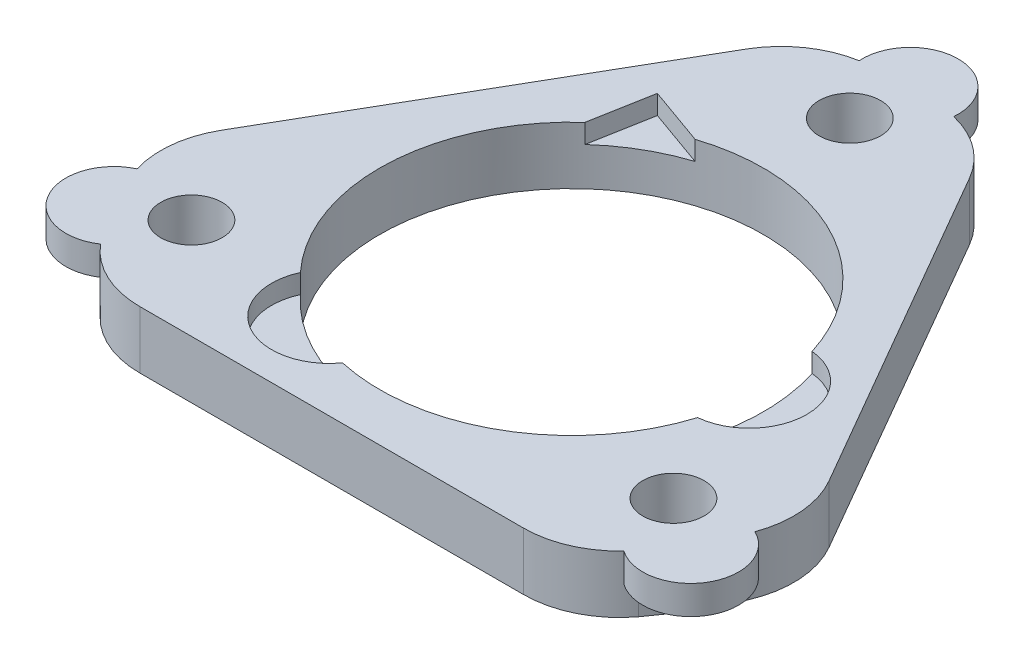
ISO-10303-21;
HEADER;
FILE_DESCRIPTION(('STEP AP214'),'2;1');
FILE_NAME('part.step','',(''),(''),'','','');
FILE_SCHEMA(('AUTOMOTIVE_DESIGN { 1 0 10303 214 1 1 1 1 }'));
ENDSEC;
DATA;
#1=APPLICATION_CONTEXT('core data for automotive mechanical design processes');
#2=APPLICATION_PROTOCOL_DEFINITION('international standard','automotive_design',2000,#1);
#3=PRODUCT_CONTEXT('',#1,'mechanical');
#4=PRODUCT('Part','Part','',(#3));
#5=PRODUCT_RELATED_PRODUCT_CATEGORY('part','',(#4));
#6=PRODUCT_DEFINITION_FORMATION('','',#4);
#7=PRODUCT_DEFINITION_CONTEXT('part definition',#1,'design');
#8=PRODUCT_DEFINITION('design','',#6,#7);
#9=PRODUCT_DEFINITION_SHAPE('','',#8);
#10=(LENGTH_UNIT() NAMED_UNIT(*) SI_UNIT(.MILLI.,.METRE.));
#11=(NAMED_UNIT(*) PLANE_ANGLE_UNIT() SI_UNIT($,.RADIAN.));
#12=(NAMED_UNIT(*) SI_UNIT($,.STERADIAN.) SOLID_ANGLE_UNIT());
#13=UNCERTAINTY_MEASURE_WITH_UNIT(LENGTH_MEASURE(1.E-05),#10,'distance_accuracy_value','');
#14=(GEOMETRIC_REPRESENTATION_CONTEXT(3) GLOBAL_UNCERTAINTY_ASSIGNED_CONTEXT((#13)) GLOBAL_UNIT_ASSIGNED_CONTEXT((#10,
#11,#12)) REPRESENTATION_CONTEXT('',''));
#15=CARTESIAN_POINT('',(0.,0.,0.));
#16=DIRECTION('',(0.,0.,1.));
#17=DIRECTION('',(1.,0.,0.));
#18=AXIS2_PLACEMENT_3D('',#15,#16,#17);
#19=CARTESIAN_POINT('',(0.,6.,0.));
#20=DIRECTION('',(0.,1.,0.));
#21=DIRECTION('',(0.,0.,1.));
#22=AXIS2_PLACEMENT_3D('',#19,#20,#21);
#23=PLANE('',#22);
#24=CARTESIAN_POINT('',(-25.1147367097487,6.,14.5));
#25=DIRECTION('',(0.,1.,0.));
#26=DIRECTION('',(0.,0.,1.));
#27=AXIS2_PLACEMENT_3D('',#24,#25,#26);
#28=CIRCLE('',#27,3.2);
#29=CARTESIAN_POINT('',(-25.1147367097487,6.,17.7));
#30=VERTEX_POINT('',#29);
#31=EDGE_CURVE('E247',#30,#30,#28,.T.);
#32=ORIENTED_EDGE('',*,*,#31,.F.);
#33=EDGE_LOOP('',(#32));
#34=FACE_BOUND('',#33,.T.);
#35=CARTESIAN_POINT('',(25.1147367097487,6.,14.5));
#36=DIRECTION('',(0.,1.,0.));
#37=DIRECTION('',(0.,0.,1.));
#38=AXIS2_PLACEMENT_3D('',#35,#36,#37);
#39=CIRCLE('',#38,3.2);
#40=CARTESIAN_POINT('',(25.1147367097487,6.,17.7));
#41=VERTEX_POINT('',#40);
#42=EDGE_CURVE('E484',#41,#41,#39,.T.);
#43=ORIENTED_EDGE('',*,*,#42,.F.);
#44=EDGE_LOOP('',(#43));
#45=FACE_BOUND('',#44,.T.);
#46=CARTESIAN_POINT('',(0.,6.,-29.));
#47=DIRECTION('',(0.,1.,0.));
#48=DIRECTION('',(0.,0.,1.));
#49=AXIS2_PLACEMENT_3D('',#46,#47,#48);
#50=CIRCLE('',#49,3.2);
#51=CARTESIAN_POINT('',(0.,6.,-25.8));
#52=VERTEX_POINT('',#51);
#53=EDGE_CURVE('E487',#52,#52,#50,.T.);
#54=ORIENTED_EDGE('',*,*,#53,.F.);
#55=EDGE_LOOP('',(#54));
#56=FACE_BOUND('',#55,.T.);
#57=CARTESIAN_POINT('',(-9.23755118839425,6.,16.0286508490826));
#58=DIRECTION('',(0.,1.,0.));
#59=DIRECTION('',(0.,0.,1.));
#60=AXIS2_PLACEMENT_3D('',#57,#58,#59);
#61=CIRCLE('',#60,6.);
#62=CARTESIAN_POINT('',(-14.7045464027304,6.,13.556412323692));
#63=VERTEX_POINT('',#62);
#64=CARTESIAN_POINT('',(-4.3576026894637,6.,19.519510721347));
#65=VERTEX_POINT('',#64);
#66=EDGE_CURVE('E205',#63,#65,#61,.T.);
#67=ORIENTED_EDGE('',*,*,#66,.F.);
#68=CARTESIAN_POINT('',(0.,6.,0.));
#69=DIRECTION('',(0.,1.,0.));
#70=DIRECTION('',(0.,0.,1.));
#71=AXIS2_PLACEMENT_3D('',#68,#69,#70);
#72=CIRCLE('',#71,20.);
#73=CARTESIAN_POINT('',(-13.425383069926,6.,-14.8242736559247));
#74=VERTEX_POINT('',#73);
#75=EDGE_CURVE('E218',#74,#63,#72,.T.);
#76=ORIENTED_EDGE('',*,*,#75,.F.);
#77=DIRECTION('',(-0.178618155289891,0.,0.983918469488624));
#78=VECTOR('',#77,1.);
#79=CARTESIAN_POINT('',(-15.6023560487492,6.,-2.83241360135468));
#80=LINE('',#79,#78);
#81=CARTESIAN_POINT('',(-12.2664788714975,6.,-21.2080997756778));
#82=VERTEX_POINT('',#81);
#83=EDGE_CURVE('E238',#82,#74,#80,.T.);
#84=ORIENTED_EDGE('',*,*,#83,.F.);
#85=DIRECTION('',(0.941930338748527,0.,0.335808333644484));
#86=VECTOR('',#85,1.);
#87=CARTESIAN_POINT('',(5.32503591317024,6.,-14.9365348593483));
#88=LINE('',#87,#86);
#89=CARTESIAN_POINT('',(-6.15507870374182,6.,-19.029319644978));
#90=VERTEX_POINT('',#89);
#91=EDGE_CURVE('E244',#82,#90,#88,.T.);
#92=ORIENTED_EDGE('',*,*,#91,.T.);
#93=CARTESIAN_POINT('',(19.0831934988612,6.,-5.9859607319979));
#94=VERTEX_POINT('',#93);
#95=EDGE_CURVE('E295',#94,#90,#72,.T.);
#96=ORIENTED_EDGE('',*,*,#95,.F.);
#97=CARTESIAN_POINT('',(18.4999944178949,6.,-0.0143714266320205));
#98=DIRECTION('',(0.,1.,0.));
#99=DIRECTION('',(0.,0.,1.));
#100=AXIS2_PLACEMENT_3D('',#97,#98,#99);
#101=CIRCLE('',#100,6.);
#102=CARTESIAN_POINT('',(19.0924706578586,6.,5.95630457404651));
#103=VERTEX_POINT('',#102);
#104=EDGE_CURVE('E226',#103,#94,#101,.T.);
#105=ORIENTED_EDGE('',*,*,#104,.F.);
#106=EDGE_CURVE('E292',#65,#103,#72,.T.);
#107=ORIENTED_EDGE('',*,*,#106,.F.);
#108=EDGE_LOOP('',(#67,#76,#84,#92,#96,#105,#107));
#109=FACE_BOUND('',#108,.T.);
#110=CARTESIAN_POINT('',(-30.4536294819663,6.,17.2504043829445));
#111=DIRECTION('',(0.,1.,0.));
#112=DIRECTION('',(0.,0.,1.));
#113=AXIS2_PLACEMENT_3D('',#110,#111,#112);
#114=CIRCLE('',#113,5.);
#115=CARTESIAN_POINT('',(-32.5618339352836,6.,12.7165898760405));
#116=VERTEX_POINT('',#115);
#117=CARTESIAN_POINT('',(-27.6767457832055,6.,21.4083987219927));
#118=VERTEX_POINT('',#117);
#119=EDGE_CURVE('E284',#116,#118,#114,.T.);
#120=ORIENTED_EDGE('',*,*,#119,.T.);
#121=CARTESIAN_POINT('',(-20.,6.,15.));
#122=DIRECTION('',(0.,1.,0.));
#123=DIRECTION('',(0.,0.,1.));
#124=AXIS2_PLACEMENT_3D('',#121,#122,#123);
#125=CIRCLE('',#124,10.);
#126=CARTESIAN_POINT('',(-20.,6.,25.));
#127=VERTEX_POINT('',#126);
#128=EDGE_CURVE('E338',#118,#127,#125,.T.);
#129=ORIENTED_EDGE('',*,*,#128,.T.);
#130=DIRECTION('',(1.,0.,0.));
#131=VECTOR('',#130,1.);
#132=CARTESIAN_POINT('',(-43.301270189222,6.,25.));
#133=LINE('',#132,#131);
#134=CARTESIAN_POINT('',(20.,6.,25.));
#135=VERTEX_POINT('',#134);
#136=EDGE_CURVE('E258',#127,#135,#133,.T.);
#137=ORIENTED_EDGE('',*,*,#136,.T.);
#138=CARTESIAN_POINT('',(20.,6.,15.));
#139=DIRECTION('',(0.,1.,0.));
#140=DIRECTION('',(0.,0.,1.));
#141=AXIS2_PLACEMENT_3D('',#138,#139,#140);
#142=CIRCLE('',#141,10.);
#143=CARTESIAN_POINT('',(27.2938068498009,6.,21.8410804437455));
#144=VERTEX_POINT('',#143);
#145=EDGE_CURVE('E332',#135,#144,#142,.T.);
#146=ORIENTED_EDGE('',*,*,#145,.T.);
#147=CARTESIAN_POINT('',(30.1661031621676,6.,17.7484145773493));
#148=DIRECTION('',(0.,1.,0.));
#149=DIRECTION('',(0.,0.,1.));
#150=AXIS2_PLACEMENT_3D('',#147,#148,#149);
#151=CIRCLE('',#150,5.);
#152=CARTESIAN_POINT('',(32.3785900391947,6.,13.2645655813434));
#153=VERTEX_POINT('',#152);
#154=EDGE_CURVE('E270',#144,#153,#151,.T.);
#155=ORIENTED_EDGE('',*,*,#154,.T.);
#156=CARTESIAN_POINT('',(22.9903810567666,6.,9.82050807568875));
#157=DIRECTION('',(0.,1.,0.));
#158=DIRECTION('',(0.,0.,1.));
#159=AXIS2_PLACEMENT_3D('',#156,#157,#158);
#160=CIRCLE('',#159,10.);
#161=CARTESIAN_POINT('',(31.650635094611,6.,4.82050807568876));
#162=VERTEX_POINT('',#161);
#163=EDGE_CURVE('E330',#153,#162,#160,.T.);
#164=ORIENTED_EDGE('',*,*,#163,.T.);
#165=DIRECTION('',(-0.5,0.,-0.866025403784438));
#166=VECTOR('',#165,1.);
#167=CARTESIAN_POINT('',(43.301270189222,6.,25.));
#168=LINE('',#167,#166);
#169=CARTESIAN_POINT('',(11.650635094611,6.,-29.8205080756888));
#170=VERTEX_POINT('',#169);
#171=EDGE_CURVE('E220',#162,#170,#168,.T.);
#172=ORIENTED_EDGE('',*,*,#171,.T.);
#173=CARTESIAN_POINT('',(2.9903810567666,6.,-24.8205080756888));
#174=DIRECTION('',(0.,1.,0.));
#175=DIRECTION('',(0.,0.,1.));
#176=AXIS2_PLACEMENT_3D('',#173,#174,#175);
#177=CIRCLE('',#176,10.);
#178=CARTESIAN_POINT('',(5.26802708548266,6.,-34.5576703197861));
#179=VERTEX_POINT('',#178);
#180=EDGE_CURVE('E327',#170,#179,#177,.T.);
#181=ORIENTED_EDGE('',*,*,#180,.T.);
#182=CARTESIAN_POINT('',(0.287526319798734,6.,-34.9988189602938));
#183=DIRECTION('',(0.,1.,0.));
#184=DIRECTION('',(0.,0.,1.));
#185=AXIS2_PLACEMENT_3D('',#182,#183,#184);
#186=CIRCLE('',#185,5.);
#187=CARTESIAN_POINT('',(-4.70184425598925,6.,-34.6729643033361));
#188=VERTEX_POINT('',#187);
#189=EDGE_CURVE('E277',#179,#188,#186,.T.);
#190=ORIENTED_EDGE('',*,*,#189,.T.);
#191=CARTESIAN_POINT('',(-2.99038105676657,6.,-24.8205080756888));
#192=DIRECTION('',(0.,1.,0.));
#193=DIRECTION('',(0.,0.,1.));
#194=AXIS2_PLACEMENT_3D('',#191,#192,#193);
#195=CIRCLE('',#194,10.);
#196=CARTESIAN_POINT('',(-11.650635094611,6.,-29.8205080756888));
#197=VERTEX_POINT('',#196);
#198=EDGE_CURVE('E325',#188,#197,#195,.T.);
#199=ORIENTED_EDGE('',*,*,#198,.T.);
#200=DIRECTION('',(-0.5,0.,0.866025403784438));
#201=VECTOR('',#200,1.);
#202=CARTESIAN_POINT('',(0.,6.,-50.));
#203=LINE('',#202,#201);
#204=CARTESIAN_POINT('',(-31.650635094611,6.,4.82050807568876));
#205=VERTEX_POINT('',#204);
#206=EDGE_CURVE('E255',#197,#205,#203,.T.);
#207=ORIENTED_EDGE('',*,*,#206,.T.);
#208=CARTESIAN_POINT('',(-22.9903810567666,6.,9.82050807568877));
#209=DIRECTION('',(0.,1.,0.));
#210=DIRECTION('',(0.,0.,1.));
#211=AXIS2_PLACEMENT_3D('',#208,#209,#210);
#212=CIRCLE('',#211,10.);
#213=EDGE_CURVE('E335',#205,#116,#212,.T.);
#214=ORIENTED_EDGE('',*,*,#213,.T.);
#215=EDGE_LOOP('',(#120,#129,#137,#146,#155,#164,#172,#181,#190,#199,#207,#214));
#216=FACE_BOUND('',#215,.T.);
#217=ADVANCED_FACE('F35',(#34,#45,#56,#109,#216),#23,.T.);
#218=CARTESIAN_POINT('',(0.,6.,0.));
#219=DIRECTION('',(0.,-1.,0.));
#220=DIRECTION('',(0.,0.,-1.));
#221=AXIS2_PLACEMENT_3D('',#218,#219,#220);
#222=CYLINDRICAL_SURFACE('',#221,20.);
#223=DIRECTION('',(0.,1.,0.));
#224=VECTOR('',#223,1.);
#225=CARTESIAN_POINT('',(-14.7045464027304,4.,13.556412323692));
#226=LINE('',#225,#224);
#227=CARTESIAN_POINT('',(-14.7045464027304,4.,13.556412323692));
#228=VERTEX_POINT('',#227);
#229=EDGE_CURVE('E209',#228,#63,#226,.T.);
#230=ORIENTED_EDGE('',*,*,#229,.F.);
#231=CARTESIAN_POINT('',(0.,4.,0.));
#232=DIRECTION('',(0.,1.,0.));
#233=DIRECTION('',(0.,0.,1.));
#234=AXIS2_PLACEMENT_3D('',#231,#232,#233);
#235=CIRCLE('',#234,20.);
#236=CARTESIAN_POINT('',(-4.3576026894637,4.,19.519510721347));
#237=VERTEX_POINT('',#236);
#238=EDGE_CURVE('E200',#237,#228,#235,.F.);
#239=ORIENTED_EDGE('',*,*,#238,.F.);
#240=DIRECTION('',(0.,1.,0.));
#241=VECTOR('',#240,1.);
#242=CARTESIAN_POINT('',(-4.3576026894637,4.,19.519510721347));
#243=LINE('',#242,#241);
#244=EDGE_CURVE('E211',#237,#65,#243,.T.);
#245=ORIENTED_EDGE('',*,*,#244,.T.);
#246=ORIENTED_EDGE('',*,*,#106,.T.);
#247=DIRECTION('',(0.,1.,0.));
#248=VECTOR('',#247,1.);
#249=CARTESIAN_POINT('',(19.0924706578586,4.,5.95630457404651));
#250=LINE('',#249,#248);
#251=CARTESIAN_POINT('',(19.0924706578586,4.,5.95630457404651));
#252=VERTEX_POINT('',#251);
#253=EDGE_CURVE('E228',#252,#103,#250,.T.);
#254=ORIENTED_EDGE('',*,*,#253,.F.);
#255=CARTESIAN_POINT('',(0.,4.,0.));
#256=DIRECTION('',(0.,1.,0.));
#257=DIRECTION('',(0.,0.,1.));
#258=AXIS2_PLACEMENT_3D('',#255,#256,#257);
#259=CIRCLE('',#258,20.);
#260=CARTESIAN_POINT('',(19.0831934988612,4.,-5.9859607319979));
#261=VERTEX_POINT('',#260);
#262=EDGE_CURVE('E224',#261,#252,#259,.F.);
#263=ORIENTED_EDGE('',*,*,#262,.F.);
#264=DIRECTION('',(0.,1.,0.));
#265=VECTOR('',#264,1.);
#266=CARTESIAN_POINT('',(19.0831934988612,4.,-5.9859607319979));
#267=LINE('',#266,#265);
#268=EDGE_CURVE('E231',#261,#94,#267,.T.);
#269=ORIENTED_EDGE('',*,*,#268,.T.);
#270=ORIENTED_EDGE('',*,*,#95,.T.);
#271=DIRECTION('',(0.,1.,0.));
#272=VECTOR('',#271,1.);
#273=CARTESIAN_POINT('',(-6.15507870374182,4.,-19.029319644978));
#274=LINE('',#273,#272);
#275=CARTESIAN_POINT('',(-6.15507870374182,4.,-19.029319644978));
#276=VERTEX_POINT('',#275);
#277=EDGE_CURVE('E230',#276,#90,#274,.T.);
#278=ORIENTED_EDGE('',*,*,#277,.F.);
#279=CARTESIAN_POINT('',(0.,4.,0.));
#280=DIRECTION('',(0.,1.,0.));
#281=DIRECTION('',(0.,0.,1.));
#282=AXIS2_PLACEMENT_3D('',#279,#280,#281);
#283=CIRCLE('',#282,20.);
#284=CARTESIAN_POINT('',(-13.425383069926,4.,-14.8242736559247));
#285=VERTEX_POINT('',#284);
#286=EDGE_CURVE('E240',#285,#276,#283,.F.);
#287=ORIENTED_EDGE('',*,*,#286,.F.);
#288=DIRECTION('',(0.,1.,0.));
#289=VECTOR('',#288,1.);
#290=CARTESIAN_POINT('',(-13.425383069926,4.,-14.8242736559247));
#291=LINE('',#290,#289);
#292=EDGE_CURVE('E250',#285,#74,#291,.T.);
#293=ORIENTED_EDGE('',*,*,#292,.T.);
#294=ORIENTED_EDGE('',*,*,#75,.T.);
#295=EDGE_LOOP('',(#230,#239,#245,#246,#254,#263,#269,#270,#278,#287,#293,#294));
#296=FACE_BOUND('',#295,.T.);
#297=CARTESIAN_POINT('',(0.,0.,0.));
#298=DIRECTION('',(0.,1.,0.));
#299=DIRECTION('',(0.,0.,1.));
#300=AXIS2_PLACEMENT_3D('',#297,#298,#299);
#301=CIRCLE('',#300,20.);
#302=CARTESIAN_POINT('',(0.,0.,20.));
#303=VERTEX_POINT('',#302);
#304=EDGE_CURVE('E291',#303,#303,#301,.T.);
#305=ORIENTED_EDGE('',*,*,#304,.F.);
#306=EDGE_LOOP('',(#305));
#307=FACE_BOUND('',#306,.T.);
#308=ADVANCED_FACE('F214',(#296,#307),#222,.F.);
#309=CARTESIAN_POINT('',(0.,0.,0.));
#310=DIRECTION('',(0.,1.,0.));
#311=DIRECTION('',(0.,0.,1.));
#312=AXIS2_PLACEMENT_3D('',#309,#310,#311);
#313=PLANE('',#312);
#314=CARTESIAN_POINT('',(-25.1147367097487,0.,14.5));
#315=DIRECTION('',(0.,-1.,0.));
#316=DIRECTION('',(0.,0.,-1.));
#317=AXIS2_PLACEMENT_3D('',#314,#315,#316);
#318=CIRCLE('',#317,3.2);
#319=CARTESIAN_POINT('',(-25.1147367097487,0.,11.3));
#320=VERTEX_POINT('',#319);
#321=EDGE_CURVE('E490',#320,#320,#318,.T.);
#322=ORIENTED_EDGE('',*,*,#321,.F.);
#323=EDGE_LOOP('',(#322));
#324=FACE_BOUND('',#323,.T.);
#325=CARTESIAN_POINT('',(25.1147367097487,0.,14.5));
#326=DIRECTION('',(0.,-1.,0.));
#327=DIRECTION('',(0.,0.,-1.));
#328=AXIS2_PLACEMENT_3D('',#325,#326,#327);
#329=CIRCLE('',#328,3.2);
#330=CARTESIAN_POINT('',(25.1147367097487,0.,11.3));
#331=VERTEX_POINT('',#330);
#332=EDGE_CURVE('E494',#331,#331,#329,.T.);
#333=ORIENTED_EDGE('',*,*,#332,.F.);
#334=EDGE_LOOP('',(#333));
#335=FACE_BOUND('',#334,.T.);
#336=CARTESIAN_POINT('',(0.,0.,-29.));
#337=DIRECTION('',(0.,-1.,0.));
#338=DIRECTION('',(0.,0.,-1.));
#339=AXIS2_PLACEMENT_3D('',#336,#337,#338);
#340=CIRCLE('',#339,3.2);
#341=CARTESIAN_POINT('',(0.,0.,-32.2));
#342=VERTEX_POINT('',#341);
#343=EDGE_CURVE('E491',#342,#342,#340,.T.);
#344=ORIENTED_EDGE('',*,*,#343,.F.);
#345=EDGE_LOOP('',(#344));
#346=FACE_BOUND('',#345,.T.);
#347=ORIENTED_EDGE('',*,*,#304,.T.);
#348=EDGE_LOOP('',(#347));
#349=FACE_BOUND('',#348,.T.);
#350=DIRECTION('',(1.,0.,0.));
#351=VECTOR('',#350,1.);
#352=CARTESIAN_POINT('',(0.,0.,25.));
#353=LINE('',#352,#351);
#354=CARTESIAN_POINT('',(-20.,0.,25.));
#355=VERTEX_POINT('',#354);
#356=CARTESIAN_POINT('',(20.,0.,25.));
#357=VERTEX_POINT('',#356);
#358=EDGE_CURVE('E264',#355,#357,#353,.T.);
#359=ORIENTED_EDGE('',*,*,#358,.F.);
#360=CARTESIAN_POINT('',(-20.,0.,15.));
#361=DIRECTION('',(0.,1.,0.));
#362=DIRECTION('',(0.,0.,1.));
#363=AXIS2_PLACEMENT_3D('',#360,#361,#362);
#364=CIRCLE('',#363,10.);
#365=CARTESIAN_POINT('',(-28.,0.,21.));
#366=VERTEX_POINT('',#365);
#367=EDGE_CURVE('E319',#355,#366,#364,.F.);
#368=ORIENTED_EDGE('',*,*,#367,.T.);
#369=CARTESIAN_POINT('',(0.,0.,0.));
#370=DIRECTION('',(0.,1.,0.));
#371=DIRECTION('',(0.,0.,1.));
#372=AXIS2_PLACEMENT_3D('',#369,#370,#371);
#373=CIRCLE('',#372,35.);
#374=CARTESIAN_POINT('',(-32.1865334794732,0.,13.7487113059643));
#375=VERTEX_POINT('',#374);
#376=EDGE_CURVE('E302',#375,#366,#373,.T.);
#377=ORIENTED_EDGE('',*,*,#376,.F.);
#378=CARTESIAN_POINT('',(-22.9903810567666,0.,9.82050807568877));
#379=DIRECTION('',(0.,1.,0.));
#380=DIRECTION('',(0.,0.,1.));
#381=AXIS2_PLACEMENT_3D('',#378,#379,#380);
#382=CIRCLE('',#381,10.);
#383=CARTESIAN_POINT('',(-31.650635094611,0.,4.82050807568878));
#384=VERTEX_POINT('',#383);
#385=EDGE_CURVE('E317',#375,#384,#382,.F.);
#386=ORIENTED_EDGE('',*,*,#385,.T.);
#387=DIRECTION('',(-0.5,0.,0.866025403784439));
#388=VECTOR('',#387,1.);
#389=CARTESIAN_POINT('',(-21.650635094611,0.,-12.5));
#390=LINE('',#389,#388);
#391=CARTESIAN_POINT('',(-11.650635094611,0.,-29.8205080756888));
#392=VERTEX_POINT('',#391);
#393=EDGE_CURVE('E261',#392,#384,#390,.T.);
#394=ORIENTED_EDGE('',*,*,#393,.F.);
#395=CARTESIAN_POINT('',(-2.99038105676657,0.,-24.8205080756888));
#396=DIRECTION('',(0.,1.,0.));
#397=DIRECTION('',(0.,0.,1.));
#398=AXIS2_PLACEMENT_3D('',#395,#396,#397);
#399=CIRCLE('',#398,10.);
#400=CARTESIAN_POINT('',(-4.1865334794732,0.,-34.7487113059643));
#401=VERTEX_POINT('',#400);
#402=EDGE_CURVE('E309',#392,#401,#399,.F.);
#403=ORIENTED_EDGE('',*,*,#402,.T.);
#404=CARTESIAN_POINT('',(4.18653347947323,0.,-34.7487113059643));
#405=VERTEX_POINT('',#404);
#406=EDGE_CURVE('E298',#405,#401,#373,.T.);
#407=ORIENTED_EDGE('',*,*,#406,.F.);
#408=CARTESIAN_POINT('',(2.9903810567666,0.,-24.8205080756888));
#409=DIRECTION('',(0.,1.,0.));
#410=DIRECTION('',(0.,0.,1.));
#411=AXIS2_PLACEMENT_3D('',#408,#409,#410);
#412=CIRCLE('',#411,10.);
#413=CARTESIAN_POINT('',(11.650635094611,0.,-29.8205080756888));
#414=VERTEX_POINT('',#413);
#415=EDGE_CURVE('E311',#405,#414,#412,.F.);
#416=ORIENTED_EDGE('',*,*,#415,.T.);
#417=DIRECTION('',(-0.5,0.,-0.866025403784439));
#418=VECTOR('',#417,1.);
#419=CARTESIAN_POINT('',(21.650635094611,0.,-12.5));
#420=LINE('',#419,#418);
#421=CARTESIAN_POINT('',(31.650635094611,0.,4.82050807568876));
#422=VERTEX_POINT('',#421);
#423=EDGE_CURVE('E267',#422,#414,#420,.T.);
#424=ORIENTED_EDGE('',*,*,#423,.F.);
#425=CARTESIAN_POINT('',(22.9903810567666,0.,9.82050807568875));
#426=DIRECTION('',(0.,1.,0.));
#427=DIRECTION('',(0.,0.,1.));
#428=AXIS2_PLACEMENT_3D('',#425,#426,#427);
#429=CIRCLE('',#428,10.);
#430=CARTESIAN_POINT('',(32.1865334794732,0.,13.7487113059643));
#431=VERTEX_POINT('',#430);
#432=EDGE_CURVE('E313',#422,#431,#429,.F.);
#433=ORIENTED_EDGE('',*,*,#432,.T.);
#434=CARTESIAN_POINT('',(28.,0.,21.));
#435=VERTEX_POINT('',#434);
#436=EDGE_CURVE('E301',#435,#431,#373,.T.);
#437=ORIENTED_EDGE('',*,*,#436,.F.);
#438=CARTESIAN_POINT('',(20.,0.,15.));
#439=DIRECTION('',(0.,1.,0.));
#440=DIRECTION('',(0.,0.,1.));
#441=AXIS2_PLACEMENT_3D('',#438,#439,#440);
#442=CIRCLE('',#441,10.);
#443=EDGE_CURVE('E315',#435,#357,#442,.F.);
#444=ORIENTED_EDGE('',*,*,#443,.T.);
#445=EDGE_LOOP('',(#359,#368,#377,#386,#394,#403,#407,#416,#424,#433,#437,#444));
#446=FACE_BOUND('',#445,.T.);
#447=ADVANCED_FACE('F414',(#324,#335,#346,#349,#446),#313,.F.);
#448=CARTESIAN_POINT('',(0.,6.,0.));
#449=DIRECTION('',(0.,-1.,0.));
#450=DIRECTION('',(0.,0.,-1.));
#451=AXIS2_PLACEMENT_3D('',#448,#449,#450);
#452=CYLINDRICAL_SURFACE('',#451,35.);
#453=CARTESIAN_POINT('',(0.,3.,0.));
#454=DIRECTION('',(0.,1.,0.));
#455=DIRECTION('',(0.,0.,1.));
#456=AXIS2_PLACEMENT_3D('',#453,#454,#455);
#457=CIRCLE('',#456,35.);
#458=CARTESIAN_POINT('',(28.,3.,21.));
#459=VERTEX_POINT('',#458);
#460=CARTESIAN_POINT('',(32.1865334794732,3.,13.7487113059643));
#461=VERTEX_POINT('',#460);
#462=EDGE_CURVE('E273',#459,#461,#457,.T.);
#463=ORIENTED_EDGE('',*,*,#462,.F.);
#464=DIRECTION('',(0.,-1.,0.));
#465=VECTOR('',#464,1.);
#466=CARTESIAN_POINT('',(28.,6.,21.));
#467=LINE('',#466,#465);
#468=EDGE_CURVE('E348',#459,#435,#467,.T.);
#469=ORIENTED_EDGE('',*,*,#468,.T.);
#470=ORIENTED_EDGE('',*,*,#436,.T.);
#471=DIRECTION('',(0.,-1.,0.));
#472=VECTOR('',#471,1.);
#473=CARTESIAN_POINT('',(32.1865334794732,6.,13.7487113059643));
#474=LINE('',#473,#472);
#475=EDGE_CURVE('E346',#431,#461,#474,.F.);
#476=ORIENTED_EDGE('',*,*,#475,.T.);
#477=EDGE_LOOP('',(#463,#469,#470,#476));
#478=FACE_BOUND('',#477,.T.);
#479=ADVANCED_FACE('F437',(#478),#452,.T.);
#480=CARTESIAN_POINT('',(0.,3.,0.));
#481=DIRECTION('',(0.,1.,0.));
#482=DIRECTION('',(0.,0.,1.));
#483=AXIS2_PLACEMENT_3D('',#480,#481,#482);
#484=CIRCLE('',#483,35.);
#485=CARTESIAN_POINT('',(4.18653347947323,3.,-34.7487113059643));
#486=VERTEX_POINT('',#485);
#487=CARTESIAN_POINT('',(-4.1865334794732,3.,-34.7487113059643));
#488=VERTEX_POINT('',#487);
#489=EDGE_CURVE('E280',#486,#488,#484,.T.);
#490=ORIENTED_EDGE('',*,*,#489,.F.);
#491=DIRECTION('',(0.,-1.,0.));
#492=VECTOR('',#491,1.);
#493=CARTESIAN_POINT('',(4.18653347947323,6.,-34.7487113059643));
#494=LINE('',#493,#492);
#495=EDGE_CURVE('E358',#486,#405,#494,.T.);
#496=ORIENTED_EDGE('',*,*,#495,.T.);
#497=ORIENTED_EDGE('',*,*,#406,.T.);
#498=DIRECTION('',(0.,-1.,0.));
#499=VECTOR('',#498,1.);
#500=CARTESIAN_POINT('',(-4.1865334794732,6.,-34.7487113059643));
#501=LINE('',#500,#499);
#502=EDGE_CURVE('E356',#401,#488,#501,.F.);
#503=ORIENTED_EDGE('',*,*,#502,.T.);
#504=EDGE_LOOP('',(#490,#496,#497,#503));
#505=FACE_BOUND('',#504,.T.);
#506=ADVANCED_FACE('F405',(#505),#452,.T.);
#507=ORIENTED_EDGE('',*,*,#376,.T.);
#508=DIRECTION('',(0.,-1.,0.));
#509=VECTOR('',#508,1.);
#510=CARTESIAN_POINT('',(-28.,6.,21.));
#511=LINE('',#510,#509);
#512=CARTESIAN_POINT('',(-28.,3.,21.));
#513=VERTEX_POINT('',#512);
#514=EDGE_CURVE('E323',#366,#513,#511,.F.);
#515=ORIENTED_EDGE('',*,*,#514,.T.);
#516=CARTESIAN_POINT('',(0.,3.,0.));
#517=DIRECTION('',(0.,1.,0.));
#518=DIRECTION('',(0.,0.,1.));
#519=AXIS2_PLACEMENT_3D('',#516,#517,#518);
#520=CIRCLE('',#519,35.);
#521=CARTESIAN_POINT('',(-32.1865334794732,3.,13.7487113059643));
#522=VERTEX_POINT('',#521);
#523=EDGE_CURVE('E287',#522,#513,#520,.T.);
#524=ORIENTED_EDGE('',*,*,#523,.F.);
#525=DIRECTION('',(0.,-1.,0.));
#526=VECTOR('',#525,1.);
#527=CARTESIAN_POINT('',(-32.1865334794732,6.,13.7487113059643));
#528=LINE('',#527,#526);
#529=EDGE_CURVE('E321',#522,#375,#528,.T.);
#530=ORIENTED_EDGE('',*,*,#529,.T.);
#531=EDGE_LOOP('',(#507,#515,#524,#530));
#532=FACE_BOUND('',#531,.T.);
#533=ADVANCED_FACE('F461',(#532),#452,.T.);
#534=CARTESIAN_POINT('',(-30.4536294819663,3.,17.2504043829445));
#535=DIRECTION('',(0.,1.,0.));
#536=DIRECTION('',(0.,0.,1.));
#537=AXIS2_PLACEMENT_3D('',#534,#535,#536);
#538=CYLINDRICAL_SURFACE('',#537,5.);
#539=ORIENTED_EDGE('',*,*,#119,.F.);
#540=DIRECTION('',(0.,1.,0.));
#541=VECTOR('',#540,1.);
#542=CARTESIAN_POINT('',(-32.5618339352836,6.,12.7165898760405));
#543=LINE('',#542,#541);
#544=CARTESIAN_POINT('',(-32.5618339352836,3.,12.7165898760405));
#545=VERTEX_POINT('',#544);
#546=EDGE_CURVE('E366',#116,#545,#543,.F.);
#547=ORIENTED_EDGE('',*,*,#546,.T.);
#548=CARTESIAN_POINT('',(-30.4536294819663,3.,17.2504043829445));
#549=DIRECTION('',(0.,1.,0.));
#550=DIRECTION('',(0.,0.,1.));
#551=AXIS2_PLACEMENT_3D('',#548,#549,#550);
#552=CIRCLE('',#551,5.);
#553=CARTESIAN_POINT('',(-27.6767457832055,3.,21.4083987219927));
#554=VERTEX_POINT('',#553);
#555=EDGE_CURVE('E285',#545,#554,#552,.T.);
#556=ORIENTED_EDGE('',*,*,#555,.T.);
#557=DIRECTION('',(0.,1.,0.));
#558=VECTOR('',#557,1.);
#559=CARTESIAN_POINT('',(-27.6767457832055,3.,21.4083987219927));
#560=LINE('',#559,#558);
#561=EDGE_CURVE('E363',#554,#118,#560,.T.);
#562=ORIENTED_EDGE('',*,*,#561,.T.);
#563=EDGE_LOOP('',(#539,#547,#556,#562));
#564=FACE_BOUND('',#563,.T.);
#565=ADVANCED_FACE('F518',(#564),#538,.T.);
#566=CARTESIAN_POINT('',(-30.4536294819663,3.,17.2504043829445));
#567=DIRECTION('',(0.,1.,0.));
#568=DIRECTION('',(0.,0.,1.));
#569=AXIS2_PLACEMENT_3D('',#566,#567,#568);
#570=PLANE('',#569);
#571=ORIENTED_EDGE('',*,*,#555,.F.);
#572=CARTESIAN_POINT('',(-22.9903810567666,3.,9.82050807568877));
#573=DIRECTION('',(0.,1.,0.));
#574=DIRECTION('',(0.,0.,1.));
#575=AXIS2_PLACEMENT_3D('',#572,#573,#574);
#576=CIRCLE('',#575,10.);
#577=EDGE_CURVE('E369',#545,#522,#576,.T.);
#578=ORIENTED_EDGE('',*,*,#577,.T.);
#579=ORIENTED_EDGE('',*,*,#523,.T.);
#580=CARTESIAN_POINT('',(-20.,3.,15.));
#581=DIRECTION('',(0.,1.,0.));
#582=DIRECTION('',(0.,0.,1.));
#583=AXIS2_PLACEMENT_3D('',#580,#581,#582);
#584=CIRCLE('',#583,10.);
#585=EDGE_CURVE('E360',#513,#554,#584,.T.);
#586=ORIENTED_EDGE('',*,*,#585,.T.);
#587=EDGE_LOOP('',(#571,#578,#579,#586));
#588=FACE_BOUND('',#587,.T.);
#589=ADVANCED_FACE('F560',(#588),#570,.F.);
#590=CARTESIAN_POINT('',(0.287526319798734,3.,-34.9988189602938));
#591=DIRECTION('',(0.,1.,0.));
#592=DIRECTION('',(0.,0.,1.));
#593=AXIS2_PLACEMENT_3D('',#590,#591,#592);
#594=CYLINDRICAL_SURFACE('',#593,5.);
#595=ORIENTED_EDGE('',*,*,#189,.F.);
#596=DIRECTION('',(0.,1.,0.));
#597=VECTOR('',#596,1.);
#598=CARTESIAN_POINT('',(5.26802708548266,6.,-34.5576703197861));
#599=LINE('',#598,#597);
#600=CARTESIAN_POINT('',(5.26802708548266,3.,-34.5576703197861));
#601=VERTEX_POINT('',#600);
#602=EDGE_CURVE('E382',#179,#601,#599,.F.);
#603=ORIENTED_EDGE('',*,*,#602,.T.);
#604=CARTESIAN_POINT('',(0.287526319798734,3.,-34.9988189602938));
#605=DIRECTION('',(0.,1.,0.));
#606=DIRECTION('',(0.,0.,1.));
#607=AXIS2_PLACEMENT_3D('',#604,#605,#606);
#608=CIRCLE('',#607,5.);
#609=CARTESIAN_POINT('',(-4.70184425598925,3.,-34.6729643033361));
#610=VERTEX_POINT('',#609);
#611=EDGE_CURVE('E278',#601,#610,#608,.T.);
#612=ORIENTED_EDGE('',*,*,#611,.T.);
#613=DIRECTION('',(0.,1.,0.));
#614=VECTOR('',#613,1.);
#615=CARTESIAN_POINT('',(-4.70184425598925,3.,-34.6729643033361));
#616=LINE('',#615,#614);
#617=EDGE_CURVE('E11',#610,#188,#616,.T.);
#618=ORIENTED_EDGE('',*,*,#617,.T.);
#619=EDGE_LOOP('',(#595,#603,#612,#618));
#620=FACE_BOUND('',#619,.T.);
#621=ADVANCED_FACE('F397',(#620),#594,.T.);
#622=CARTESIAN_POINT('',(0.287526319798734,3.,-34.9988189602938));
#623=DIRECTION('',(0.,1.,0.));
#624=DIRECTION('',(0.,0.,1.));
#625=AXIS2_PLACEMENT_3D('',#622,#623,#624);
#626=PLANE('',#625);
#627=ORIENTED_EDGE('',*,*,#611,.F.);
#628=CARTESIAN_POINT('',(2.9903810567666,3.,-24.8205080756888));
#629=DIRECTION('',(0.,1.,0.));
#630=DIRECTION('',(0.,0.,1.));
#631=AXIS2_PLACEMENT_3D('',#628,#629,#630);
#632=CIRCLE('',#631,10.);
#633=EDGE_CURVE('E385',#601,#486,#632,.T.);
#634=ORIENTED_EDGE('',*,*,#633,.T.);
#635=ORIENTED_EDGE('',*,*,#489,.T.);
#636=CARTESIAN_POINT('',(-2.99038105676657,3.,-24.8205080756888));
#637=DIRECTION('',(0.,1.,0.));
#638=DIRECTION('',(0.,0.,1.));
#639=AXIS2_PLACEMENT_3D('',#636,#637,#638);
#640=CIRCLE('',#639,10.);
#641=EDGE_CURVE('E43',#488,#610,#640,.T.);
#642=ORIENTED_EDGE('',*,*,#641,.T.);
#643=EDGE_LOOP('',(#627,#634,#635,#642));
#644=FACE_BOUND('',#643,.T.);
#645=ADVANCED_FACE('F390',(#644),#626,.F.);
#646=CARTESIAN_POINT('',(30.1661031621676,3.,17.7484145773493));
#647=DIRECTION('',(0.,1.,0.));
#648=DIRECTION('',(0.,0.,1.));
#649=AXIS2_PLACEMENT_3D('',#646,#647,#648);
#650=CYLINDRICAL_SURFACE('',#649,5.);
#651=ORIENTED_EDGE('',*,*,#154,.F.);
#652=DIRECTION('',(0.,1.,0.));
#653=VECTOR('',#652,1.);
#654=CARTESIAN_POINT('',(27.2938068498009,6.,21.8410804437455));
#655=LINE('',#654,#653);
#656=CARTESIAN_POINT('',(27.2938068498009,3.,21.8410804437455));
#657=VERTEX_POINT('',#656);
#658=EDGE_CURVE('E371',#144,#657,#655,.F.);
#659=ORIENTED_EDGE('',*,*,#658,.T.);
#660=CARTESIAN_POINT('',(30.1661031621676,3.,17.7484145773493));
#661=DIRECTION('',(0.,1.,0.));
#662=DIRECTION('',(0.,0.,1.));
#663=AXIS2_PLACEMENT_3D('',#660,#661,#662);
#664=CIRCLE('',#663,5.);
#665=CARTESIAN_POINT('',(32.3785900391947,3.,13.2645655813434));
#666=VERTEX_POINT('',#665);
#667=EDGE_CURVE('E271',#657,#666,#664,.T.);
#668=ORIENTED_EDGE('',*,*,#667,.T.);
#669=DIRECTION('',(0.,1.,0.));
#670=VECTOR('',#669,1.);
#671=CARTESIAN_POINT('',(32.3785900391947,3.,13.2645655813434));
#672=LINE('',#671,#670);
#673=EDGE_CURVE('E379',#666,#153,#672,.T.);
#674=ORIENTED_EDGE('',*,*,#673,.T.);
#675=EDGE_LOOP('',(#651,#659,#668,#674));
#676=FACE_BOUND('',#675,.T.);
#677=ADVANCED_FACE('F553',(#676),#650,.T.);
#678=CARTESIAN_POINT('',(30.1661031621676,3.,17.7484145773493));
#679=DIRECTION('',(0.,1.,0.));
#680=DIRECTION('',(0.,0.,1.));
#681=AXIS2_PLACEMENT_3D('',#678,#679,#680);
#682=PLANE('',#681);
#683=ORIENTED_EDGE('',*,*,#667,.F.);
#684=CARTESIAN_POINT('',(20.,3.,15.));
#685=DIRECTION('',(0.,1.,0.));
#686=DIRECTION('',(0.,0.,1.));
#687=AXIS2_PLACEMENT_3D('',#684,#685,#686);
#688=CIRCLE('',#687,10.);
#689=EDGE_CURVE('E374',#657,#459,#688,.T.);
#690=ORIENTED_EDGE('',*,*,#689,.T.);
#691=ORIENTED_EDGE('',*,*,#462,.T.);
#692=CARTESIAN_POINT('',(22.9903810567666,3.,9.82050807568875));
#693=DIRECTION('',(0.,1.,0.));
#694=DIRECTION('',(0.,0.,1.));
#695=AXIS2_PLACEMENT_3D('',#692,#693,#694);
#696=CIRCLE('',#695,10.);
#697=EDGE_CURVE('E376',#461,#666,#696,.T.);
#698=ORIENTED_EDGE('',*,*,#697,.T.);
#699=EDGE_LOOP('',(#683,#690,#691,#698));
#700=FACE_BOUND('',#699,.T.);
#701=ADVANCED_FACE('F444',(#700),#682,.F.);
#702=CARTESIAN_POINT('',(0.,-16.,-50.));
#703=DIRECTION('',(-0.866025403784439,0.,-0.5));
#704=DIRECTION('',(-0.5,0.,0.866025403784439));
#705=AXIS2_PLACEMENT_3D('',#702,#703,#704);
#706=PLANE('',#705);
#707=ORIENTED_EDGE('',*,*,#393,.T.);
#708=DIRECTION('',(0.,1.,0.));
#709=VECTOR('',#708,1.);
#710=CARTESIAN_POINT('',(-31.650635094611,6.,4.82050807568877));
#711=LINE('',#710,#709);
#712=EDGE_CURVE('E343',#384,#205,#711,.T.);
#713=ORIENTED_EDGE('',*,*,#712,.T.);
#714=ORIENTED_EDGE('',*,*,#206,.F.);
#715=DIRECTION('',(0.,1.,0.));
#716=VECTOR('',#715,1.);
#717=CARTESIAN_POINT('',(-11.650635094611,0.,-29.8205080756888));
#718=LINE('',#717,#716);
#719=EDGE_CURVE('E340',#197,#392,#718,.F.);
#720=ORIENTED_EDGE('',*,*,#719,.T.);
#721=EDGE_LOOP('',(#707,#713,#714,#720));
#722=FACE_BOUND('',#721,.T.);
#723=ADVANCED_FACE('F411',(#722),#706,.T.);
#724=CARTESIAN_POINT('',(-43.301270189222,-16.,25.));
#725=DIRECTION('',(0.,0.,1.));
#726=DIRECTION('',(1.,0.,0.));
#727=AXIS2_PLACEMENT_3D('',#724,#725,#726);
#728=PLANE('',#727);
#729=ORIENTED_EDGE('',*,*,#136,.F.);
#730=DIRECTION('',(0.,1.,0.));
#731=VECTOR('',#730,1.);
#732=CARTESIAN_POINT('',(-20.,0.,25.));
#733=LINE('',#732,#731);
#734=EDGE_CURVE('E306',#127,#355,#733,.F.);
#735=ORIENTED_EDGE('',*,*,#734,.T.);
#736=ORIENTED_EDGE('',*,*,#358,.T.);
#737=DIRECTION('',(0.,1.,0.));
#738=VECTOR('',#737,1.);
#739=CARTESIAN_POINT('',(20.,6.,25.));
#740=LINE('',#739,#738);
#741=EDGE_CURVE('E303',#357,#135,#740,.T.);
#742=ORIENTED_EDGE('',*,*,#741,.T.);
#743=EDGE_LOOP('',(#729,#735,#736,#742));
#744=FACE_BOUND('',#743,.T.);
#745=ADVANCED_FACE('F452',(#744),#728,.T.);
#746=CARTESIAN_POINT('',(43.301270189222,-16.,25.));
#747=DIRECTION('',(0.866025403784439,0.,-0.5));
#748=DIRECTION('',(-0.5,0.,-0.866025403784439));
#749=AXIS2_PLACEMENT_3D('',#746,#747,#748);
#750=PLANE('',#749);
#751=ORIENTED_EDGE('',*,*,#171,.F.);
#752=DIRECTION('',(0.,1.,0.));
#753=VECTOR('',#752,1.);
#754=CARTESIAN_POINT('',(31.650635094611,0.,4.82050807568875));
#755=LINE('',#754,#753);
#756=EDGE_CURVE('E353',#162,#422,#755,.F.);
#757=ORIENTED_EDGE('',*,*,#756,.T.);
#758=ORIENTED_EDGE('',*,*,#423,.T.);
#759=DIRECTION('',(0.,1.,0.));
#760=VECTOR('',#759,1.);
#761=CARTESIAN_POINT('',(11.650635094611,6.,-29.8205080756888));
#762=LINE('',#761,#760);
#763=EDGE_CURVE('E350',#414,#170,#762,.T.);
#764=ORIENTED_EDGE('',*,*,#763,.T.);
#765=EDGE_LOOP('',(#751,#757,#758,#764));
#766=FACE_BOUND('',#765,.T.);
#767=ADVANCED_FACE('F427',(#766),#750,.T.);
#768=CARTESIAN_POINT('',(-20.,6.,15.));
#769=DIRECTION('',(0.,-1.,0.));
#770=DIRECTION('',(0.,0.,-1.));
#771=AXIS2_PLACEMENT_3D('',#768,#769,#770);
#772=CYLINDRICAL_SURFACE('',#771,10.);
#773=ORIENTED_EDGE('',*,*,#585,.F.);
#774=ORIENTED_EDGE('',*,*,#514,.F.);
#775=ORIENTED_EDGE('',*,*,#367,.F.);
#776=ORIENTED_EDGE('',*,*,#734,.F.);
#777=ORIENTED_EDGE('',*,*,#128,.F.);
#778=ORIENTED_EDGE('',*,*,#561,.F.);
#779=EDGE_LOOP('',(#773,#774,#775,#776,#777,#778));
#780=FACE_BOUND('',#779,.T.);
#781=ADVANCED_FACE('F457',(#780),#772,.T.);
#782=CARTESIAN_POINT('',(-22.9903810567666,6.,9.82050807568877));
#783=DIRECTION('',(0.,-1.,0.));
#784=DIRECTION('',(0.,0.,-1.));
#785=AXIS2_PLACEMENT_3D('',#782,#783,#784);
#786=CYLINDRICAL_SURFACE('',#785,10.);
#787=ORIENTED_EDGE('',*,*,#385,.F.);
#788=ORIENTED_EDGE('',*,*,#529,.F.);
#789=ORIENTED_EDGE('',*,*,#577,.F.);
#790=ORIENTED_EDGE('',*,*,#546,.F.);
#791=ORIENTED_EDGE('',*,*,#213,.F.);
#792=ORIENTED_EDGE('',*,*,#712,.F.);
#793=EDGE_LOOP('',(#787,#788,#789,#790,#791,#792));
#794=FACE_BOUND('',#793,.T.);
#795=ADVANCED_FACE('F420',(#794),#786,.T.);
#796=CARTESIAN_POINT('',(20.,6.,15.));
#797=DIRECTION('',(0.,-1.,0.));
#798=DIRECTION('',(0.,0.,-1.));
#799=AXIS2_PLACEMENT_3D('',#796,#797,#798);
#800=CYLINDRICAL_SURFACE('',#799,10.);
#801=ORIENTED_EDGE('',*,*,#443,.F.);
#802=ORIENTED_EDGE('',*,*,#468,.F.);
#803=ORIENTED_EDGE('',*,*,#689,.F.);
#804=ORIENTED_EDGE('',*,*,#658,.F.);
#805=ORIENTED_EDGE('',*,*,#145,.F.);
#806=ORIENTED_EDGE('',*,*,#741,.F.);
#807=EDGE_LOOP('',(#801,#802,#803,#804,#805,#806));
#808=FACE_BOUND('',#807,.T.);
#809=ADVANCED_FACE('F447',(#808),#800,.T.);
#810=CARTESIAN_POINT('',(22.9903810567666,6.,9.82050807568875));
#811=DIRECTION('',(0.,-1.,0.));
#812=DIRECTION('',(0.,0.,-1.));
#813=AXIS2_PLACEMENT_3D('',#810,#811,#812);
#814=CYLINDRICAL_SURFACE('',#813,10.);
#815=ORIENTED_EDGE('',*,*,#697,.F.);
#816=ORIENTED_EDGE('',*,*,#475,.F.);
#817=ORIENTED_EDGE('',*,*,#432,.F.);
#818=ORIENTED_EDGE('',*,*,#756,.F.);
#819=ORIENTED_EDGE('',*,*,#163,.F.);
#820=ORIENTED_EDGE('',*,*,#673,.F.);
#821=EDGE_LOOP('',(#815,#816,#817,#818,#819,#820));
#822=FACE_BOUND('',#821,.T.);
#823=ADVANCED_FACE('F440',(#822),#814,.T.);
#824=CARTESIAN_POINT('',(2.9903810567666,6.,-24.8205080756888));
#825=DIRECTION('',(0.,-1.,0.));
#826=DIRECTION('',(0.,0.,-1.));
#827=AXIS2_PLACEMENT_3D('',#824,#825,#826);
#828=CYLINDRICAL_SURFACE('',#827,10.);
#829=ORIENTED_EDGE('',*,*,#415,.F.);
#830=ORIENTED_EDGE('',*,*,#495,.F.);
#831=ORIENTED_EDGE('',*,*,#633,.F.);
#832=ORIENTED_EDGE('',*,*,#602,.F.);
#833=ORIENTED_EDGE('',*,*,#180,.F.);
#834=ORIENTED_EDGE('',*,*,#763,.F.);
#835=EDGE_LOOP('',(#829,#830,#831,#832,#833,#834));
#836=FACE_BOUND('',#835,.T.);
#837=ADVANCED_FACE('F403',(#836),#828,.T.);
#838=CARTESIAN_POINT('',(-2.99038105676657,6.,-24.8205080756888));
#839=DIRECTION('',(0.,-1.,0.));
#840=DIRECTION('',(0.,0.,-1.));
#841=AXIS2_PLACEMENT_3D('',#838,#839,#840);
#842=CYLINDRICAL_SURFACE('',#841,10.);
#843=ORIENTED_EDGE('',*,*,#641,.F.);
#844=ORIENTED_EDGE('',*,*,#502,.F.);
#845=ORIENTED_EDGE('',*,*,#402,.F.);
#846=ORIENTED_EDGE('',*,*,#719,.F.);
#847=ORIENTED_EDGE('',*,*,#198,.F.);
#848=ORIENTED_EDGE('',*,*,#617,.F.);
#849=EDGE_LOOP('',(#843,#844,#845,#846,#847,#848));
#850=FACE_BOUND('',#849,.T.);
#851=ADVANCED_FACE('F37',(#850),#842,.T.);
#852=CARTESIAN_POINT('',(5.32503591317024,4.,-14.9365348593483));
#853=DIRECTION('',(-0.335808333644484,0.,0.941930338748527));
#854=DIRECTION('',(0.941930338748527,0.,0.335808333644484));
#855=AXIS2_PLACEMENT_3D('',#852,#853,#854);
#856=PLANE('',#855);
#857=ORIENTED_EDGE('',*,*,#91,.F.);
#858=DIRECTION('',(0.,1.,0.));
#859=VECTOR('',#858,1.);
#860=CARTESIAN_POINT('',(-12.2664788714975,4.,-21.2080997756778));
#861=LINE('',#860,#859);
#862=CARTESIAN_POINT('',(-12.2664788714975,4.,-21.2080997756778));
#863=VERTEX_POINT('',#862);
#864=EDGE_CURVE('E243',#863,#82,#861,.T.);
#865=ORIENTED_EDGE('',*,*,#864,.F.);
#866=DIRECTION('',(0.941930338748527,0.,0.335808333644484));
#867=VECTOR('',#866,1.);
#868=CARTESIAN_POINT('',(5.32503591317024,4.,-14.9365348593483));
#869=LINE('',#868,#867);
#870=EDGE_CURVE('E235',#863,#276,#869,.T.);
#871=ORIENTED_EDGE('',*,*,#870,.T.);
#872=ORIENTED_EDGE('',*,*,#277,.T.);
#873=EDGE_LOOP('',(#857,#865,#871,#872));
#874=FACE_BOUND('',#873,.T.);
#875=ADVANCED_FACE('F474',(#874),#856,.T.);
#876=CARTESIAN_POINT('',(-15.6023560487492,4.,-2.83241360135468));
#877=DIRECTION('',(-0.983918469488624,0.,-0.178618155289891));
#878=DIRECTION('',(-0.178618155289891,0.,0.983918469488624));
#879=AXIS2_PLACEMENT_3D('',#876,#877,#878);
#880=PLANE('',#879);
#881=ORIENTED_EDGE('',*,*,#83,.T.);
#882=ORIENTED_EDGE('',*,*,#292,.F.);
#883=DIRECTION('',(-0.178618155289891,0.,0.983918469488624));
#884=VECTOR('',#883,1.);
#885=CARTESIAN_POINT('',(-15.6023560487492,4.,-2.83241360135468));
#886=LINE('',#885,#884);
#887=EDGE_CURVE('E237',#863,#285,#886,.T.);
#888=ORIENTED_EDGE('',*,*,#887,.F.);
#889=ORIENTED_EDGE('',*,*,#864,.T.);
#890=EDGE_LOOP('',(#881,#882,#888,#889));
#891=FACE_BOUND('',#890,.T.);
#892=ADVANCED_FACE('F537',(#891),#880,.F.);
#893=CARTESIAN_POINT('',(0.,4.,0.));
#894=DIRECTION('',(0.,1.,0.));
#895=DIRECTION('',(0.,0.,1.));
#896=AXIS2_PLACEMENT_3D('',#893,#894,#895);
#897=PLANE('',#896);
#898=ORIENTED_EDGE('',*,*,#870,.F.);
#899=ORIENTED_EDGE('',*,*,#887,.T.);
#900=ORIENTED_EDGE('',*,*,#286,.T.);
#901=EDGE_LOOP('',(#898,#899,#900));
#902=FACE_BOUND('',#901,.T.);
#903=ADVANCED_FACE('F478',(#902),#897,.T.);
#904=CARTESIAN_POINT('',(18.4999944178949,4.,-0.0143714266320205));
#905=DIRECTION('',(0.,1.,0.));
#906=DIRECTION('',(0.,0.,1.));
#907=AXIS2_PLACEMENT_3D('',#904,#905,#906);
#908=CYLINDRICAL_SURFACE('',#907,6.);
#909=ORIENTED_EDGE('',*,*,#104,.T.);
#910=ORIENTED_EDGE('',*,*,#268,.F.);
#911=CARTESIAN_POINT('',(18.4999944178949,4.,-0.0143714266320205));
#912=DIRECTION('',(0.,1.,0.));
#913=DIRECTION('',(0.,0.,1.));
#914=AXIS2_PLACEMENT_3D('',#911,#912,#913);
#915=CIRCLE('',#914,6.);
#916=EDGE_CURVE('E56',#252,#261,#915,.T.);
#917=ORIENTED_EDGE('',*,*,#916,.F.);
#918=ORIENTED_EDGE('',*,*,#253,.T.);
#919=EDGE_LOOP('',(#909,#910,#917,#918));
#920=FACE_BOUND('',#919,.T.);
#921=ADVANCED_FACE('F630',(#920),#908,.F.);
#922=CARTESIAN_POINT('',(0.,4.,0.));
#923=DIRECTION('',(0.,1.,0.));
#924=DIRECTION('',(0.,0.,1.));
#925=AXIS2_PLACEMENT_3D('',#922,#923,#924);
#926=PLANE('',#925);
#927=ORIENTED_EDGE('',*,*,#262,.T.);
#928=ORIENTED_EDGE('',*,*,#916,.T.);
#929=EDGE_LOOP('',(#927,#928));
#930=FACE_BOUND('',#929,.T.);
#931=ADVANCED_FACE('F627',(#930),#926,.T.);
#932=CARTESIAN_POINT('',(-9.23755118839425,4.,16.0286508490826));
#933=DIRECTION('',(0.,1.,0.));
#934=DIRECTION('',(0.,0.,1.));
#935=AXIS2_PLACEMENT_3D('',#932,#933,#934);
#936=CYLINDRICAL_SURFACE('',#935,6.);
#937=ORIENTED_EDGE('',*,*,#66,.T.);
#938=ORIENTED_EDGE('',*,*,#244,.F.);
#939=CARTESIAN_POINT('',(-9.23755118839425,4.,16.0286508490826));
#940=DIRECTION('',(0.,1.,0.));
#941=DIRECTION('',(0.,0.,1.));
#942=AXIS2_PLACEMENT_3D('',#939,#940,#941);
#943=CIRCLE('',#942,6.);
#944=EDGE_CURVE('E49',#228,#237,#943,.T.);
#945=ORIENTED_EDGE('',*,*,#944,.F.);
#946=ORIENTED_EDGE('',*,*,#229,.T.);
#947=EDGE_LOOP('',(#937,#938,#945,#946));
#948=FACE_BOUND('',#947,.T.);
#949=ADVANCED_FACE('F208',(#948),#936,.F.);
#950=CARTESIAN_POINT('',(0.,4.,0.));
#951=DIRECTION('',(0.,1.,0.));
#952=DIRECTION('',(0.,0.,1.));
#953=AXIS2_PLACEMENT_3D('',#950,#951,#952);
#954=PLANE('',#953);
#955=ORIENTED_EDGE('',*,*,#238,.T.);
#956=ORIENTED_EDGE('',*,*,#944,.T.);
#957=EDGE_LOOP('',(#955,#956));
#958=FACE_BOUND('',#957,.T.);
#959=ADVANCED_FACE('F201',(#958),#954,.T.);
#960=CARTESIAN_POINT('',(0.,10.,-29.));
#961=DIRECTION('',(0.,-1.,0.));
#962=DIRECTION('',(0.,0.,-1.));
#963=AXIS2_PLACEMENT_3D('',#960,#961,#962);
#964=CYLINDRICAL_SURFACE('',#963,3.2);
#965=ORIENTED_EDGE('',*,*,#53,.T.);
#966=EDGE_LOOP('',(#965));
#967=FACE_BOUND('',#966,.T.);
#968=ORIENTED_EDGE('',*,*,#343,.T.);
#969=EDGE_LOOP('',(#968));
#970=FACE_BOUND('',#969,.T.);
#971=ADVANCED_FACE('F593',(#967,#970),#964,.F.);
#972=CARTESIAN_POINT('',(25.1147367097487,10.,14.5));
#973=DIRECTION('',(0.,-1.,0.));
#974=DIRECTION('',(0.,0.,-1.));
#975=AXIS2_PLACEMENT_3D('',#972,#973,#974);
#976=CYLINDRICAL_SURFACE('',#975,3.2);
#977=ORIENTED_EDGE('',*,*,#42,.T.);
#978=EDGE_LOOP('',(#977));
#979=FACE_BOUND('',#978,.T.);
#980=ORIENTED_EDGE('',*,*,#332,.T.);
#981=EDGE_LOOP('',(#980));
#982=FACE_BOUND('',#981,.T.);
#983=ADVANCED_FACE('F598',(#979,#982),#976,.F.);
#984=CARTESIAN_POINT('',(-25.1147367097487,10.,14.5));
#985=DIRECTION('',(0.,-1.,0.));
#986=DIRECTION('',(0.,0.,-1.));
#987=AXIS2_PLACEMENT_3D('',#984,#985,#986);
#988=CYLINDRICAL_SURFACE('',#987,3.2);
#989=ORIENTED_EDGE('',*,*,#31,.T.);
#990=EDGE_LOOP('',(#989));
#991=FACE_BOUND('',#990,.T.);
#992=ORIENTED_EDGE('',*,*,#321,.T.);
#993=EDGE_LOOP('',(#992));
#994=FACE_BOUND('',#993,.T.);
#995=ADVANCED_FACE('F500',(#991,#994),#988,.F.);
#996=CLOSED_SHELL('',(#217,#308,#447,#479,#506,#533,#565,#589,#621,#645,#677,#701,#723,#745,
#767,#781,#795,#809,#823,#837,#851,#875,#892,#903,#921,#931,#949,#959,#971,#983,#995));
#997=MANIFOLD_SOLID_BREP('B2',#996);
#998=ADVANCED_BREP_SHAPE_REPRESENTATION('',(#18,#997),#14);
#999=SHAPE_DEFINITION_REPRESENTATION(#9,#998);
ENDSEC;
END-ISO-10303-21;
